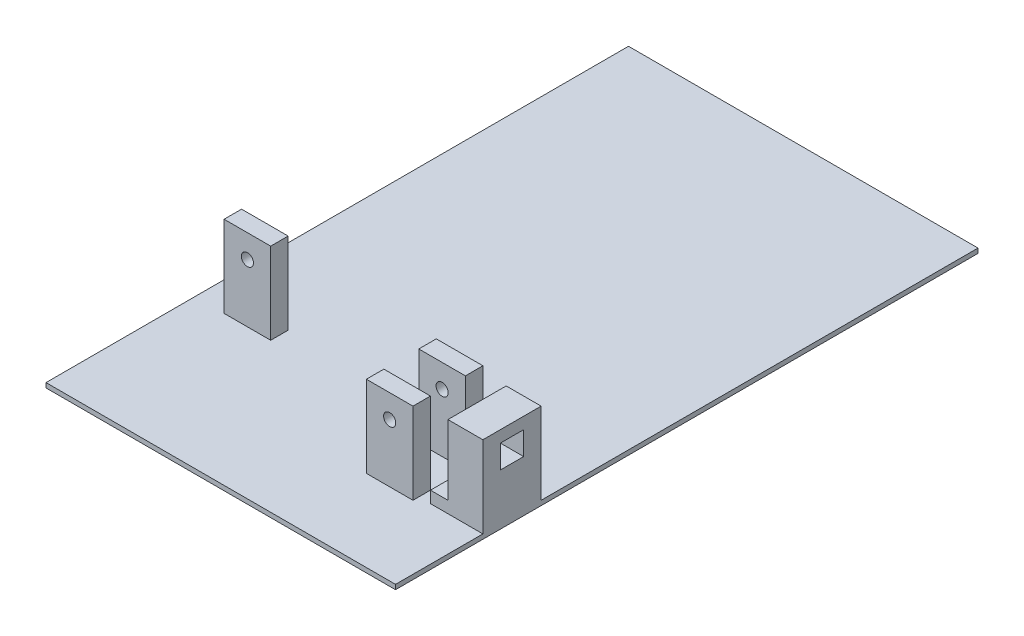
ISO-10303-21;
HEADER;
FILE_DESCRIPTION(('STEP AP214'),'2;1');
FILE_NAME('part.step','',(''),(''),'','','');
FILE_SCHEMA(('AUTOMOTIVE_DESIGN { 1 0 10303 214 1 1 1 1 }'));
ENDSEC;
DATA;
#1=APPLICATION_CONTEXT('core data for automotive mechanical design processes');
#2=APPLICATION_PROTOCOL_DEFINITION('international standard','automotive_design',2000,#1);
#3=PRODUCT_CONTEXT('',#1,'mechanical');
#4=PRODUCT('Part','Part','',(#3));
#5=PRODUCT_RELATED_PRODUCT_CATEGORY('part','',(#4));
#6=PRODUCT_DEFINITION_FORMATION('','',#4);
#7=PRODUCT_DEFINITION_CONTEXT('part definition',#1,'design');
#8=PRODUCT_DEFINITION('design','',#6,#7);
#9=PRODUCT_DEFINITION_SHAPE('','',#8);
#10=(LENGTH_UNIT() NAMED_UNIT(*) SI_UNIT(.MILLI.,.METRE.));
#11=(NAMED_UNIT(*) PLANE_ANGLE_UNIT() SI_UNIT($,.RADIAN.));
#12=(NAMED_UNIT(*) SI_UNIT($,.STERADIAN.) SOLID_ANGLE_UNIT());
#13=UNCERTAINTY_MEASURE_WITH_UNIT(LENGTH_MEASURE(1.E-05),#10,'distance_accuracy_value','');
#14=(GEOMETRIC_REPRESENTATION_CONTEXT(3) GLOBAL_UNCERTAINTY_ASSIGNED_CONTEXT((#13)) GLOBAL_UNIT_ASSIGNED_CONTEXT((#10,
#11,#12)) REPRESENTATION_CONTEXT('',''));
#15=CARTESIAN_POINT('',(0.,0.,0.));
#16=DIRECTION('',(0.,0.,1.));
#17=DIRECTION('',(1.,0.,0.));
#18=AXIS2_PLACEMENT_3D('',#15,#16,#17);
#19=CARTESIAN_POINT('',(300.,4.,0.));
#20=DIRECTION('',(-1.,0.,0.));
#21=DIRECTION('',(0.,0.,1.));
#22=AXIS2_PLACEMENT_3D('',#19,#20,#21);
#23=PLANE('',#22);
#24=DIRECTION('',(0.,0.,-1.));
#25=VECTOR('',#24,1.);
#26=CARTESIAN_POINT('',(300.,0.,0.));
#27=LINE('',#26,#25);
#28=CARTESIAN_POINT('',(300.,0.,0.));
#29=VERTEX_POINT('',#28);
#30=CARTESIAN_POINT('',(300.,0.,-500.));
#31=VERTEX_POINT('',#30);
#32=EDGE_CURVE('E386',#29,#31,#27,.T.);
#33=ORIENTED_EDGE('',*,*,#32,.T.);
#34=DIRECTION('',(0.,-1.,0.));
#35=VECTOR('',#34,1.);
#36=CARTESIAN_POINT('',(300.,4.,-500.));
#37=LINE('',#36,#35);
#38=CARTESIAN_POINT('',(300.,4.,-500.));
#39=VERTEX_POINT('',#38);
#40=EDGE_CURVE('E11',#39,#31,#37,.T.);
#41=ORIENTED_EDGE('',*,*,#40,.F.);
#42=DIRECTION('',(0.,0.,-1.));
#43=VECTOR('',#42,1.);
#44=CARTESIAN_POINT('',(300.,4.,0.));
#45=LINE('',#44,#43);
#46=CARTESIAN_POINT('',(300.,4.,-125.));
#47=VERTEX_POINT('',#46);
#48=EDGE_CURVE('E396',#47,#39,#45,.T.);
#49=ORIENTED_EDGE('',*,*,#48,.F.);
#50=DIRECTION('',(0.,-1.,0.));
#51=VECTOR('',#50,1.);
#52=CARTESIAN_POINT('',(300.,14.,-125.));
#53=LINE('',#52,#51);
#54=CARTESIAN_POINT('',(300.,74.,-125.));
#55=VERTEX_POINT('',#54);
#56=EDGE_CURVE('E384',#55,#47,#53,.T.);
#57=ORIENTED_EDGE('',*,*,#56,.F.);
#58=DIRECTION('',(0.,0.,1.));
#59=VECTOR('',#58,1.);
#60=CARTESIAN_POINT('',(300.,74.,0.));
#61=LINE('',#60,#59);
#62=CARTESIAN_POINT('',(300.,74.,-75.));
#63=VERTEX_POINT('',#62);
#64=EDGE_CURVE('E350',#55,#63,#61,.T.);
#65=ORIENTED_EDGE('',*,*,#64,.T.);
#66=DIRECTION('',(0.,-1.,0.));
#67=VECTOR('',#66,1.);
#68=CARTESIAN_POINT('',(300.,14.,-75.));
#69=LINE('',#68,#67);
#70=CARTESIAN_POINT('',(300.,4.,-75.));
#71=VERTEX_POINT('',#70);
#72=EDGE_CURVE('E376',#63,#71,#69,.T.);
#73=ORIENTED_EDGE('',*,*,#72,.T.);
#74=CARTESIAN_POINT('',(300.,4.,0.));
#75=VERTEX_POINT('',#74);
#76=EDGE_CURVE('E392',#75,#71,#45,.T.);
#77=ORIENTED_EDGE('',*,*,#76,.F.);
#78=DIRECTION('',(0.,-1.,0.));
#79=VECTOR('',#78,1.);
#80=CARTESIAN_POINT('',(300.,4.,0.));
#81=LINE('',#80,#79);
#82=EDGE_CURVE('E404',#75,#29,#81,.T.);
#83=ORIENTED_EDGE('',*,*,#82,.T.);
#84=EDGE_LOOP('',(#33,#41,#49,#57,#65,#73,#77,#83));
#85=FACE_BOUND('',#84,.T.);
#86=DIRECTION('',(0.,1.,0.));
#87=VECTOR('',#86,1.);
#88=CARTESIAN_POINT('',(300.,4.,-90.));
#89=LINE('',#88,#87);
#90=CARTESIAN_POINT('',(300.,44.,-90.));
#91=VERTEX_POINT('',#90);
#92=CARTESIAN_POINT('',(300.,64.,-90.));
#93=VERTEX_POINT('',#92);
#94=EDGE_CURVE('E55',#91,#93,#89,.T.);
#95=ORIENTED_EDGE('',*,*,#94,.T.);
#96=DIRECTION('',(0.,0.,-1.));
#97=VECTOR('',#96,1.);
#98=CARTESIAN_POINT('',(300.,64.,0.));
#99=LINE('',#98,#97);
#100=CARTESIAN_POINT('',(300.,64.,-110.));
#101=VERTEX_POINT('',#100);
#102=EDGE_CURVE('E232',#93,#101,#99,.T.);
#103=ORIENTED_EDGE('',*,*,#102,.T.);
#104=DIRECTION('',(0.,1.,0.));
#105=VECTOR('',#104,1.);
#106=CARTESIAN_POINT('',(300.,4.,-110.));
#107=LINE('',#106,#105);
#108=CARTESIAN_POINT('',(300.,44.,-110.));
#109=VERTEX_POINT('',#108);
#110=EDGE_CURVE('E480',#109,#101,#107,.T.);
#111=ORIENTED_EDGE('',*,*,#110,.F.);
#112=DIRECTION('',(0.,0.,-1.));
#113=VECTOR('',#112,1.);
#114=CARTESIAN_POINT('',(300.,44.,0.));
#115=LINE('',#114,#113);
#116=EDGE_CURVE('E228',#91,#109,#115,.T.);
#117=ORIENTED_EDGE('',*,*,#116,.F.);
#118=EDGE_LOOP('',(#95,#103,#111,#117));
#119=FACE_BOUND('',#118,.T.);
#120=ADVANCED_FACE('F39',(#85,#119),#23,.F.);
#121=CARTESIAN_POINT('',(0.,4.,0.));
#122=DIRECTION('',(0.,1.,0.));
#123=DIRECTION('',(0.,0.,1.));
#124=AXIS2_PLACEMENT_3D('',#121,#122,#123);
#125=PLANE('',#124);
#126=DIRECTION('',(1.,0.,0.));
#127=VECTOR('',#126,1.);
#128=CARTESIAN_POINT('',(0.,4.,-74.9999999999998));
#129=LINE('',#128,#127);
#130=CARTESIAN_POINT('',(255.,4.,-75.));
#131=VERTEX_POINT('',#130);
#132=EDGE_CURVE('E365',#131,#71,#129,.T.);
#133=ORIENTED_EDGE('',*,*,#132,.F.);
#134=DIRECTION('',(0.,0.,-1.));
#135=VECTOR('',#134,1.);
#136=CARTESIAN_POINT('',(255.,4.,-5.66213742558831E-13));
#137=LINE('',#136,#135);
#138=CARTESIAN_POINT('',(255.,4.,-125.));
#139=VERTEX_POINT('',#138);
#140=EDGE_CURVE('E379',#131,#139,#137,.T.);
#141=ORIENTED_EDGE('',*,*,#140,.T.);
#142=DIRECTION('',(1.,0.,0.));
#143=VECTOR('',#142,1.);
#144=CARTESIAN_POINT('',(0.,4.,-125.));
#145=LINE('',#144,#143);
#146=EDGE_CURVE('E370',#139,#47,#145,.T.);
#147=ORIENTED_EDGE('',*,*,#146,.T.);
#148=ORIENTED_EDGE('',*,*,#48,.T.);
#149=DIRECTION('',(1.,0.,0.));
#150=VECTOR('',#149,1.);
#151=CARTESIAN_POINT('',(0.,4.,-500.));
#152=LINE('',#151,#150);
#153=CARTESIAN_POINT('',(-1.11022302462516E-13,4.,-500.));
#154=VERTEX_POINT('',#153);
#155=EDGE_CURVE('E395',#154,#39,#152,.T.);
#156=ORIENTED_EDGE('',*,*,#155,.F.);
#157=DIRECTION('',(0.,0.,-1.));
#158=VECTOR('',#157,1.);
#159=CARTESIAN_POINT('',(0.,4.,0.));
#160=LINE('',#159,#158);
#161=CARTESIAN_POINT('',(0.,4.,0.));
#162=VERTEX_POINT('',#161);
#163=EDGE_CURVE('E399',#162,#154,#160,.T.);
#164=ORIENTED_EDGE('',*,*,#163,.F.);
#165=DIRECTION('',(1.,0.,0.));
#166=VECTOR('',#165,1.);
#167=CARTESIAN_POINT('',(0.,4.,0.));
#168=LINE('',#167,#166);
#169=EDGE_CURVE('E402',#162,#75,#168,.T.);
#170=ORIENTED_EDGE('',*,*,#169,.T.);
#171=ORIENTED_EDGE('',*,*,#76,.T.);
#172=EDGE_LOOP('',(#133,#141,#147,#148,#156,#164,#170,#171));
#173=FACE_BOUND('',#172,.T.);
#174=DIRECTION('',(1.,0.,0.));
#175=VECTOR('',#174,1.);
#176=CARTESIAN_POINT('',(0.,4.,-130.));
#177=LINE('',#176,#175);
#178=CARTESIAN_POINT('',(205.,4.,-130.));
#179=VERTEX_POINT('',#178);
#180=CARTESIAN_POINT('',(245.,4.,-130.));
#181=VERTEX_POINT('',#180);
#182=EDGE_CURVE('E330',#179,#181,#177,.T.);
#183=ORIENTED_EDGE('',*,*,#182,.T.);
#184=DIRECTION('',(0.,0.,-1.));
#185=VECTOR('',#184,1.);
#186=CARTESIAN_POINT('',(245.,4.,0.));
#187=LINE('',#186,#185);
#188=CARTESIAN_POINT('',(245.,4.,-115.));
#189=VERTEX_POINT('',#188);
#190=EDGE_CURVE('E314',#189,#181,#187,.T.);
#191=ORIENTED_EDGE('',*,*,#190,.F.);
#192=DIRECTION('',(-1.,0.,0.));
#193=VECTOR('',#192,1.);
#194=CARTESIAN_POINT('',(0.,4.,-115.));
#195=LINE('',#194,#193);
#196=CARTESIAN_POINT('',(205.,4.,-115.));
#197=VERTEX_POINT('',#196);
#198=EDGE_CURVE('E318',#189,#197,#195,.T.);
#199=ORIENTED_EDGE('',*,*,#198,.T.);
#200=DIRECTION('',(0.,0.,-1.));
#201=VECTOR('',#200,1.);
#202=CARTESIAN_POINT('',(205.,4.,0.));
#203=LINE('',#202,#201);
#204=EDGE_CURVE('E332',#197,#179,#203,.T.);
#205=ORIENTED_EDGE('',*,*,#204,.T.);
#206=EDGE_LOOP('',(#183,#191,#199,#205));
#207=FACE_BOUND('',#206,.T.);
#208=DIRECTION('',(0.,0.,-1.));
#209=VECTOR('',#208,1.);
#210=CARTESIAN_POINT('',(205.,4.,0.));
#211=LINE('',#210,#209);
#212=CARTESIAN_POINT('',(205.,4.,-70.));
#213=VERTEX_POINT('',#212);
#214=CARTESIAN_POINT('',(205.,4.,-85.));
#215=VERTEX_POINT('',#214);
#216=EDGE_CURVE('E299',#213,#215,#211,.T.);
#217=ORIENTED_EDGE('',*,*,#216,.T.);
#218=DIRECTION('',(-1.,0.,0.));
#219=VECTOR('',#218,1.);
#220=CARTESIAN_POINT('',(0.,4.,-84.9999999999999));
#221=LINE('',#220,#219);
#222=CARTESIAN_POINT('',(245.,4.,-85.));
#223=VERTEX_POINT('',#222);
#224=EDGE_CURVE('E285',#223,#215,#221,.T.);
#225=ORIENTED_EDGE('',*,*,#224,.F.);
#226=DIRECTION('',(0.,0.,-1.));
#227=VECTOR('',#226,1.);
#228=CARTESIAN_POINT('',(245.,4.,0.));
#229=LINE('',#228,#227);
#230=CARTESIAN_POINT('',(245.,4.,-70.));
#231=VERTEX_POINT('',#230);
#232=EDGE_CURVE('E289',#231,#223,#229,.T.);
#233=ORIENTED_EDGE('',*,*,#232,.F.);
#234=DIRECTION('',(1.,0.,0.));
#235=VECTOR('',#234,1.);
#236=CARTESIAN_POINT('',(0.,4.,-70.));
#237=LINE('',#236,#235);
#238=EDGE_CURVE('E302',#213,#231,#237,.T.);
#239=ORIENTED_EDGE('',*,*,#238,.F.);
#240=EDGE_LOOP('',(#217,#225,#233,#239));
#241=FACE_BOUND('',#240,.T.);
#242=DIRECTION('',(-1.,0.,0.));
#243=VECTOR('',#242,1.);
#244=CARTESIAN_POINT('',(0.,4.,-142.866666062451));
#245=LINE('',#244,#243);
#246=CARTESIAN_POINT('',(65.0000000000001,4.,-142.866666062451));
#247=VERTEX_POINT('',#246);
#248=CARTESIAN_POINT('',(25.0000000000001,4.,-142.866666062451));
#249=VERTEX_POINT('',#248);
#250=EDGE_CURVE('E63',#247,#249,#245,.T.);
#251=ORIENTED_EDGE('',*,*,#250,.F.);
#252=DIRECTION('',(0.,0.,-1.));
#253=VECTOR('',#252,1.);
#254=CARTESIAN_POINT('',(65.0000000000001,4.,0.));
#255=LINE('',#254,#253);
#256=CARTESIAN_POINT('',(65.0000000000001,4.,-127.866666062451));
#257=VERTEX_POINT('',#256);
#258=EDGE_CURVE('E255',#257,#247,#255,.T.);
#259=ORIENTED_EDGE('',*,*,#258,.F.);
#260=DIRECTION('',(-1.,0.,0.));
#261=VECTOR('',#260,1.);
#262=CARTESIAN_POINT('',(0.,4.,-127.866666062451));
#263=LINE('',#262,#261);
#264=CARTESIAN_POINT('',(25.0000000000001,4.,-127.866666062451));
#265=VERTEX_POINT('',#264);
#266=EDGE_CURVE('E260',#257,#265,#263,.T.);
#267=ORIENTED_EDGE('',*,*,#266,.T.);
#268=DIRECTION('',(0.,0.,-1.));
#269=VECTOR('',#268,1.);
#270=CARTESIAN_POINT('',(25.0000000000001,4.,0.));
#271=LINE('',#270,#269);
#272=EDGE_CURVE('E272',#265,#249,#271,.T.);
#273=ORIENTED_EDGE('',*,*,#272,.T.);
#274=EDGE_LOOP('',(#251,#259,#267,#273));
#275=FACE_BOUND('',#274,.T.);
#276=ADVANCED_FACE('F447',(#173,#207,#241,#275),#125,.T.);
#277=CARTESIAN_POINT('',(0.,14.,0.));
#278=DIRECTION('',(0.,1.,0.));
#279=DIRECTION('',(0.,0.,1.));
#280=AXIS2_PLACEMENT_3D('',#277,#278,#279);
#281=PLANE('',#280);
#282=DIRECTION('',(1.,0.,0.));
#283=VECTOR('',#282,1.);
#284=CARTESIAN_POINT('',(0.,14.,-74.9999999999998));
#285=LINE('',#284,#283);
#286=CARTESIAN_POINT('',(255.,14.,-75.));
#287=VERTEX_POINT('',#286);
#288=CARTESIAN_POINT('',(270.,14.,-75.));
#289=VERTEX_POINT('',#288);
#290=EDGE_CURVE('E366',#287,#289,#285,.T.);
#291=ORIENTED_EDGE('',*,*,#290,.T.);
#292=DIRECTION('',(0.,0.,-1.));
#293=VECTOR('',#292,1.);
#294=CARTESIAN_POINT('',(270.,14.,0.));
#295=LINE('',#294,#293);
#296=CARTESIAN_POINT('',(270.,14.,-125.));
#297=VERTEX_POINT('',#296);
#298=EDGE_CURVE('E346',#289,#297,#295,.T.);
#299=ORIENTED_EDGE('',*,*,#298,.T.);
#300=DIRECTION('',(1.,0.,0.));
#301=VECTOR('',#300,1.);
#302=CARTESIAN_POINT('',(0.,14.,-125.));
#303=LINE('',#302,#301);
#304=CARTESIAN_POINT('',(255.,14.,-125.));
#305=VERTEX_POINT('',#304);
#306=EDGE_CURVE('E373',#305,#297,#303,.T.);
#307=ORIENTED_EDGE('',*,*,#306,.F.);
#308=DIRECTION('',(0.,0.,-1.));
#309=VECTOR('',#308,1.);
#310=CARTESIAN_POINT('',(255.,14.,-5.66213742558831E-13));
#311=LINE('',#310,#309);
#312=EDGE_CURVE('E369',#287,#305,#311,.T.);
#313=ORIENTED_EDGE('',*,*,#312,.F.);
#314=EDGE_LOOP('',(#291,#299,#307,#313));
#315=FACE_BOUND('',#314,.T.);
#316=ADVANCED_FACE('F470',(#315),#281,.T.);
#317=CARTESIAN_POINT('',(0.,4.,-500.));
#318=DIRECTION('',(0.,0.,-1.));
#319=DIRECTION('',(-1.,0.,0.));
#320=AXIS2_PLACEMENT_3D('',#317,#318,#319);
#321=PLANE('',#320);
#322=DIRECTION('',(1.,0.,0.));
#323=VECTOR('',#322,1.);
#324=CARTESIAN_POINT('',(0.,0.,-500.));
#325=LINE('',#324,#323);
#326=CARTESIAN_POINT('',(-1.11022302462516E-13,0.,-500.));
#327=VERTEX_POINT('',#326);
#328=EDGE_CURVE('E407',#327,#31,#325,.T.);
#329=ORIENTED_EDGE('',*,*,#328,.F.);
#330=DIRECTION('',(0.,-1.,0.));
#331=VECTOR('',#330,1.);
#332=CARTESIAN_POINT('',(-1.11022302462516E-13,4.,-500.));
#333=LINE('',#332,#331);
#334=EDGE_CURVE('E47',#154,#327,#333,.T.);
#335=ORIENTED_EDGE('',*,*,#334,.F.);
#336=ORIENTED_EDGE('',*,*,#155,.T.);
#337=ORIENTED_EDGE('',*,*,#40,.T.);
#338=EDGE_LOOP('',(#329,#335,#336,#337));
#339=FACE_BOUND('',#338,.T.);
#340=ADVANCED_FACE('F543',(#339),#321,.T.);
#341=CARTESIAN_POINT('',(0.,4.,0.));
#342=DIRECTION('',(-1.,0.,0.));
#343=DIRECTION('',(0.,0.,1.));
#344=AXIS2_PLACEMENT_3D('',#341,#342,#343);
#345=PLANE('',#344);
#346=DIRECTION('',(0.,0.,-1.));
#347=VECTOR('',#346,1.);
#348=CARTESIAN_POINT('',(0.,0.,0.));
#349=LINE('',#348,#347);
#350=CARTESIAN_POINT('',(0.,0.,0.));
#351=VERTEX_POINT('',#350);
#352=EDGE_CURVE('E410',#351,#327,#349,.T.);
#353=ORIENTED_EDGE('',*,*,#352,.F.);
#354=DIRECTION('',(0.,-1.,0.));
#355=VECTOR('',#354,1.);
#356=CARTESIAN_POINT('',(0.,4.,0.));
#357=LINE('',#356,#355);
#358=EDGE_CURVE('E417',#162,#351,#357,.T.);
#359=ORIENTED_EDGE('',*,*,#358,.F.);
#360=ORIENTED_EDGE('',*,*,#163,.T.);
#361=ORIENTED_EDGE('',*,*,#334,.T.);
#362=EDGE_LOOP('',(#353,#359,#360,#361));
#363=FACE_BOUND('',#362,.T.);
#364=ADVANCED_FACE('F536',(#363),#345,.T.);
#365=CARTESIAN_POINT('',(0.,4.,0.));
#366=DIRECTION('',(0.,0.,-1.));
#367=DIRECTION('',(-1.,0.,0.));
#368=AXIS2_PLACEMENT_3D('',#365,#366,#367);
#369=PLANE('',#368);
#370=DIRECTION('',(1.,0.,0.));
#371=VECTOR('',#370,1.);
#372=CARTESIAN_POINT('',(0.,0.,0.));
#373=LINE('',#372,#371);
#374=EDGE_CURVE('E413',#351,#29,#373,.T.);
#375=ORIENTED_EDGE('',*,*,#374,.T.);
#376=ORIENTED_EDGE('',*,*,#82,.F.);
#377=ORIENTED_EDGE('',*,*,#169,.F.);
#378=ORIENTED_EDGE('',*,*,#358,.T.);
#379=EDGE_LOOP('',(#375,#376,#377,#378));
#380=FACE_BOUND('',#379,.T.);
#381=ADVANCED_FACE('F540',(#380),#369,.F.);
#382=CARTESIAN_POINT('',(0.,0.,0.));
#383=DIRECTION('',(0.,1.,0.));
#384=DIRECTION('',(0.,0.,1.));
#385=AXIS2_PLACEMENT_3D('',#382,#383,#384);
#386=PLANE('',#385);
#387=ORIENTED_EDGE('',*,*,#32,.F.);
#388=ORIENTED_EDGE('',*,*,#374,.F.);
#389=ORIENTED_EDGE('',*,*,#352,.T.);
#390=ORIENTED_EDGE('',*,*,#328,.T.);
#391=EDGE_LOOP('',(#387,#388,#389,#390));
#392=FACE_BOUND('',#391,.T.);
#393=ADVANCED_FACE('F542',(#392),#386,.F.);
#394=CARTESIAN_POINT('',(0.,14.,-125.));
#395=DIRECTION('',(0.,0.,-1.));
#396=DIRECTION('',(-1.,0.,0.));
#397=AXIS2_PLACEMENT_3D('',#394,#395,#396);
#398=PLANE('',#397);
#399=ORIENTED_EDGE('',*,*,#146,.F.);
#400=DIRECTION('',(0.,-1.,0.));
#401=VECTOR('',#400,1.);
#402=CARTESIAN_POINT('',(255.,14.,-125.));
#403=LINE('',#402,#401);
#404=EDGE_CURVE('E387',#305,#139,#403,.T.);
#405=ORIENTED_EDGE('',*,*,#404,.F.);
#406=ORIENTED_EDGE('',*,*,#306,.T.);
#407=DIRECTION('',(0.,-1.,0.));
#408=VECTOR('',#407,1.);
#409=CARTESIAN_POINT('',(270.,74.,-125.));
#410=LINE('',#409,#408);
#411=CARTESIAN_POINT('',(270.,74.,-125.));
#412=VERTEX_POINT('',#411);
#413=EDGE_CURVE('E363',#412,#297,#410,.T.);
#414=ORIENTED_EDGE('',*,*,#413,.F.);
#415=DIRECTION('',(1.,0.,0.));
#416=VECTOR('',#415,1.);
#417=CARTESIAN_POINT('',(0.,74.,-125.));
#418=LINE('',#417,#416);
#419=EDGE_CURVE('E353',#412,#55,#418,.T.);
#420=ORIENTED_EDGE('',*,*,#419,.T.);
#421=ORIENTED_EDGE('',*,*,#56,.T.);
#422=EDGE_LOOP('',(#399,#405,#406,#414,#420,#421));
#423=FACE_BOUND('',#422,.T.);
#424=ADVANCED_FACE('F522',(#423),#398,.T.);
#425=CARTESIAN_POINT('',(255.,14.,-5.66213742558831E-13));
#426=DIRECTION('',(-1.,0.,0.));
#427=DIRECTION('',(0.,0.,1.));
#428=AXIS2_PLACEMENT_3D('',#425,#426,#427);
#429=PLANE('',#428);
#430=ORIENTED_EDGE('',*,*,#140,.F.);
#431=DIRECTION('',(0.,-1.,0.));
#432=VECTOR('',#431,1.);
#433=CARTESIAN_POINT('',(255.,14.,-75.));
#434=LINE('',#433,#432);
#435=EDGE_CURVE('E389',#287,#131,#434,.T.);
#436=ORIENTED_EDGE('',*,*,#435,.F.);
#437=ORIENTED_EDGE('',*,*,#312,.T.);
#438=ORIENTED_EDGE('',*,*,#404,.T.);
#439=EDGE_LOOP('',(#430,#436,#437,#438));
#440=FACE_BOUND('',#439,.T.);
#441=ADVANCED_FACE('F524',(#440),#429,.T.);
#442=CARTESIAN_POINT('',(0.,14.,-74.9999999999998));
#443=DIRECTION('',(0.,0.,-1.));
#444=DIRECTION('',(-1.,0.,0.));
#445=AXIS2_PLACEMENT_3D('',#442,#443,#444);
#446=PLANE('',#445);
#447=ORIENTED_EDGE('',*,*,#132,.T.);
#448=ORIENTED_EDGE('',*,*,#72,.F.);
#449=DIRECTION('',(1.,0.,0.));
#450=VECTOR('',#449,1.);
#451=CARTESIAN_POINT('',(0.,74.,-74.9999999999998));
#452=LINE('',#451,#450);
#453=CARTESIAN_POINT('',(270.,74.,-75.));
#454=VERTEX_POINT('',#453);
#455=EDGE_CURVE('E347',#454,#63,#452,.T.);
#456=ORIENTED_EDGE('',*,*,#455,.F.);
#457=DIRECTION('',(0.,-1.,0.));
#458=VECTOR('',#457,1.);
#459=CARTESIAN_POINT('',(270.,74.,-75.));
#460=LINE('',#459,#458);
#461=EDGE_CURVE('E359',#454,#289,#460,.T.);
#462=ORIENTED_EDGE('',*,*,#461,.T.);
#463=ORIENTED_EDGE('',*,*,#290,.F.);
#464=ORIENTED_EDGE('',*,*,#435,.T.);
#465=EDGE_LOOP('',(#447,#448,#456,#462,#463,#464));
#466=FACE_BOUND('',#465,.T.);
#467=ADVANCED_FACE('F506',(#466),#446,.F.);
#468=CARTESIAN_POINT('',(270.,74.,0.));
#469=DIRECTION('',(-1.,0.,0.));
#470=DIRECTION('',(0.,0.,1.));
#471=AXIS2_PLACEMENT_3D('',#468,#469,#470);
#472=PLANE('',#471);
#473=CARTESIAN_POINT('',(270.,54.,-100.));
#474=DIRECTION('',(-1.,0.,0.));
#475=DIRECTION('',(0.,0.,1.));
#476=AXIS2_PLACEMENT_3D('',#473,#474,#475);
#477=CIRCLE('',#476,3.25000000000001);
#478=CARTESIAN_POINT('',(270.,54.,-96.75));
#479=VERTEX_POINT('',#478);
#480=EDGE_CURVE('E483',#479,#479,#477,.T.);
#481=ORIENTED_EDGE('',*,*,#480,.F.);
#482=EDGE_LOOP('',(#481));
#483=FACE_BOUND('',#482,.T.);
#484=ORIENTED_EDGE('',*,*,#298,.F.);
#485=ORIENTED_EDGE('',*,*,#461,.F.);
#486=DIRECTION('',(0.,0.,-1.));
#487=VECTOR('',#486,1.);
#488=CARTESIAN_POINT('',(270.,74.,0.));
#489=LINE('',#488,#487);
#490=EDGE_CURVE('E356',#454,#412,#489,.T.);
#491=ORIENTED_EDGE('',*,*,#490,.T.);
#492=ORIENTED_EDGE('',*,*,#413,.T.);
#493=EDGE_LOOP('',(#484,#485,#491,#492));
#494=FACE_BOUND('',#493,.T.);
#495=ADVANCED_FACE('F502',(#483,#494),#472,.T.);
#496=CARTESIAN_POINT('',(0.,74.,0.));
#497=DIRECTION('',(0.,-1.,0.));
#498=DIRECTION('',(0.,0.,-1.));
#499=AXIS2_PLACEMENT_3D('',#496,#497,#498);
#500=PLANE('',#499);
#501=ORIENTED_EDGE('',*,*,#455,.T.);
#502=ORIENTED_EDGE('',*,*,#64,.F.);
#503=ORIENTED_EDGE('',*,*,#419,.F.);
#504=ORIENTED_EDGE('',*,*,#490,.F.);
#505=EDGE_LOOP('',(#501,#502,#503,#504));
#506=FACE_BOUND('',#505,.T.);
#507=ADVANCED_FACE('F505',(#506),#500,.F.);
#508=CARTESIAN_POINT('',(245.,74.,0.));
#509=DIRECTION('',(-1.,0.,0.));
#510=DIRECTION('',(0.,0.,1.));
#511=AXIS2_PLACEMENT_3D('',#508,#509,#510);
#512=PLANE('',#511);
#513=ORIENTED_EDGE('',*,*,#190,.T.);
#514=DIRECTION('',(0.,-1.,0.));
#515=VECTOR('',#514,1.);
#516=CARTESIAN_POINT('',(245.,74.,-130.));
#517=LINE('',#516,#515);
#518=CARTESIAN_POINT('',(245.,74.,-130.));
#519=VERTEX_POINT('',#518);
#520=EDGE_CURVE('E343',#519,#181,#517,.T.);
#521=ORIENTED_EDGE('',*,*,#520,.F.);
#522=DIRECTION('',(0.,0.,-1.));
#523=VECTOR('',#522,1.);
#524=CARTESIAN_POINT('',(245.,74.,0.));
#525=LINE('',#524,#523);
#526=CARTESIAN_POINT('',(245.,74.,-115.));
#527=VERTEX_POINT('',#526);
#528=EDGE_CURVE('E315',#527,#519,#525,.T.);
#529=ORIENTED_EDGE('',*,*,#528,.F.);
#530=DIRECTION('',(0.,-1.,0.));
#531=VECTOR('',#530,1.);
#532=CARTESIAN_POINT('',(245.,74.,-115.));
#533=LINE('',#532,#531);
#534=EDGE_CURVE('E327',#527,#189,#533,.T.);
#535=ORIENTED_EDGE('',*,*,#534,.T.);
#536=EDGE_LOOP('',(#513,#521,#529,#535));
#537=FACE_BOUND('',#536,.T.);
#538=ADVANCED_FACE('F564',(#537),#512,.F.);
#539=CARTESIAN_POINT('',(0.,74.,-130.));
#540=DIRECTION('',(0.,0.,-1.));
#541=DIRECTION('',(-1.,0.,0.));
#542=AXIS2_PLACEMENT_3D('',#539,#540,#541);
#543=PLANE('',#542);
#544=CARTESIAN_POINT('',(225.,54.,-130.));
#545=DIRECTION('',(0.,0.,-1.));
#546=DIRECTION('',(-1.,0.,0.));
#547=AXIS2_PLACEMENT_3D('',#544,#545,#546);
#548=CIRCLE('',#547,5.19999999999998);
#549=CARTESIAN_POINT('',(219.8,54.,-130.));
#550=VERTEX_POINT('',#549);
#551=EDGE_CURVE('E252',#550,#550,#548,.T.);
#552=ORIENTED_EDGE('',*,*,#551,.F.);
#553=EDGE_LOOP('',(#552));
#554=FACE_BOUND('',#553,.T.);
#555=ORIENTED_EDGE('',*,*,#182,.F.);
#556=DIRECTION('',(0.,-1.,0.));
#557=VECTOR('',#556,1.);
#558=CARTESIAN_POINT('',(205.,74.,-130.));
#559=LINE('',#558,#557);
#560=CARTESIAN_POINT('',(205.,74.,-130.));
#561=VERTEX_POINT('',#560);
#562=EDGE_CURVE('E340',#561,#179,#559,.T.);
#563=ORIENTED_EDGE('',*,*,#562,.F.);
#564=DIRECTION('',(1.,0.,0.));
#565=VECTOR('',#564,1.);
#566=CARTESIAN_POINT('',(0.,74.,-130.));
#567=LINE('',#566,#565);
#568=EDGE_CURVE('E317',#561,#519,#567,.T.);
#569=ORIENTED_EDGE('',*,*,#568,.T.);
#570=ORIENTED_EDGE('',*,*,#520,.T.);
#571=EDGE_LOOP('',(#555,#563,#569,#570));
#572=FACE_BOUND('',#571,.T.);
#573=ADVANCED_FACE('F567',(#554,#572),#543,.T.);
#574=CARTESIAN_POINT('',(205.,74.,0.));
#575=DIRECTION('',(-1.,0.,0.));
#576=DIRECTION('',(0.,0.,1.));
#577=AXIS2_PLACEMENT_3D('',#574,#575,#576);
#578=PLANE('',#577);
#579=ORIENTED_EDGE('',*,*,#204,.F.);
#580=DIRECTION('',(0.,-1.,0.));
#581=VECTOR('',#580,1.);
#582=CARTESIAN_POINT('',(205.,74.,-115.));
#583=LINE('',#582,#581);
#584=CARTESIAN_POINT('',(205.,74.,-115.));
#585=VERTEX_POINT('',#584);
#586=EDGE_CURVE('E337',#585,#197,#583,.T.);
#587=ORIENTED_EDGE('',*,*,#586,.F.);
#588=DIRECTION('',(0.,0.,-1.));
#589=VECTOR('',#588,1.);
#590=CARTESIAN_POINT('',(205.,74.,0.));
#591=LINE('',#590,#589);
#592=EDGE_CURVE('E321',#585,#561,#591,.T.);
#593=ORIENTED_EDGE('',*,*,#592,.T.);
#594=ORIENTED_EDGE('',*,*,#562,.T.);
#595=EDGE_LOOP('',(#579,#587,#593,#594));
#596=FACE_BOUND('',#595,.T.);
#597=ADVANCED_FACE('F571',(#596),#578,.T.);
#598=CARTESIAN_POINT('',(0.,74.,-115.));
#599=DIRECTION('',(0.,0.,1.));
#600=DIRECTION('',(1.,0.,0.));
#601=AXIS2_PLACEMENT_3D('',#598,#599,#600);
#602=PLANE('',#601);
#603=CARTESIAN_POINT('',(225.,54.,-115.));
#604=DIRECTION('',(0.,0.,1.));
#605=DIRECTION('',(1.,0.,0.));
#606=AXIS2_PLACEMENT_3D('',#603,#604,#605);
#607=CIRCLE('',#606,5.19999999999998);
#608=CARTESIAN_POINT('',(230.2,54.,-115.));
#609=VERTEX_POINT('',#608);
#610=EDGE_CURVE('E249',#609,#609,#607,.T.);
#611=ORIENTED_EDGE('',*,*,#610,.F.);
#612=EDGE_LOOP('',(#611));
#613=FACE_BOUND('',#612,.T.);
#614=ORIENTED_EDGE('',*,*,#198,.F.);
#615=ORIENTED_EDGE('',*,*,#534,.F.);
#616=DIRECTION('',(-1.,0.,0.));
#617=VECTOR('',#616,1.);
#618=CARTESIAN_POINT('',(0.,74.,-115.));
#619=LINE('',#618,#617);
#620=EDGE_CURVE('E324',#527,#585,#619,.T.);
#621=ORIENTED_EDGE('',*,*,#620,.T.);
#622=ORIENTED_EDGE('',*,*,#586,.T.);
#623=EDGE_LOOP('',(#614,#615,#621,#622));
#624=FACE_BOUND('',#623,.T.);
#625=ADVANCED_FACE('F575',(#613,#624),#602,.T.);
#626=CARTESIAN_POINT('',(0.,74.,0.));
#627=DIRECTION('',(0.,-1.,0.));
#628=DIRECTION('',(0.,0.,-1.));
#629=AXIS2_PLACEMENT_3D('',#626,#627,#628);
#630=PLANE('',#629);
#631=ORIENTED_EDGE('',*,*,#528,.T.);
#632=ORIENTED_EDGE('',*,*,#568,.F.);
#633=ORIENTED_EDGE('',*,*,#592,.F.);
#634=ORIENTED_EDGE('',*,*,#620,.F.);
#635=EDGE_LOOP('',(#631,#632,#633,#634));
#636=FACE_BOUND('',#635,.T.);
#637=ADVANCED_FACE('F437',(#636),#630,.F.);
#638=CARTESIAN_POINT('',(0.,74.,-84.9999999999999));
#639=DIRECTION('',(0.,0.,1.));
#640=DIRECTION('',(1.,0.,0.));
#641=AXIS2_PLACEMENT_3D('',#638,#639,#640);
#642=PLANE('',#641);
#643=CARTESIAN_POINT('',(225.,54.,-85.));
#644=DIRECTION('',(0.,0.,1.));
#645=DIRECTION('',(1.,0.,0.));
#646=AXIS2_PLACEMENT_3D('',#643,#644,#645);
#647=CIRCLE('',#646,5.19999999999998);
#648=CARTESIAN_POINT('',(230.2,54.,-85.));
#649=VERTEX_POINT('',#648);
#650=EDGE_CURVE('E246',#649,#649,#647,.T.);
#651=ORIENTED_EDGE('',*,*,#650,.T.);
#652=EDGE_LOOP('',(#651));
#653=FACE_BOUND('',#652,.T.);
#654=ORIENTED_EDGE('',*,*,#224,.T.);
#655=DIRECTION('',(0.,-1.,0.));
#656=VECTOR('',#655,1.);
#657=CARTESIAN_POINT('',(205.,74.,-85.));
#658=LINE('',#657,#656);
#659=CARTESIAN_POINT('',(205.,74.,-85.));
#660=VERTEX_POINT('',#659);
#661=EDGE_CURVE('E312',#660,#215,#658,.T.);
#662=ORIENTED_EDGE('',*,*,#661,.F.);
#663=DIRECTION('',(-1.,0.,0.));
#664=VECTOR('',#663,1.);
#665=CARTESIAN_POINT('',(0.,74.,-84.9999999999999));
#666=LINE('',#665,#664);
#667=CARTESIAN_POINT('',(245.,74.,-85.));
#668=VERTEX_POINT('',#667);
#669=EDGE_CURVE('E286',#668,#660,#666,.T.);
#670=ORIENTED_EDGE('',*,*,#669,.F.);
#671=DIRECTION('',(0.,-1.,0.));
#672=VECTOR('',#671,1.);
#673=CARTESIAN_POINT('',(245.,74.,-85.));
#674=LINE('',#673,#672);
#675=EDGE_CURVE('E296',#668,#223,#674,.T.);
#676=ORIENTED_EDGE('',*,*,#675,.T.);
#677=EDGE_LOOP('',(#654,#662,#670,#676));
#678=FACE_BOUND('',#677,.T.);
#679=ADVANCED_FACE('F433',(#653,#678),#642,.F.);
#680=CARTESIAN_POINT('',(205.,74.,0.));
#681=DIRECTION('',(-1.,0.,0.));
#682=DIRECTION('',(0.,0.,1.));
#683=AXIS2_PLACEMENT_3D('',#680,#681,#682);
#684=PLANE('',#683);
#685=ORIENTED_EDGE('',*,*,#216,.F.);
#686=DIRECTION('',(0.,-1.,0.));
#687=VECTOR('',#686,1.);
#688=CARTESIAN_POINT('',(205.,74.,-70.));
#689=LINE('',#688,#687);
#690=CARTESIAN_POINT('',(205.,74.,-70.));
#691=VERTEX_POINT('',#690);
#692=EDGE_CURVE('E310',#691,#213,#689,.T.);
#693=ORIENTED_EDGE('',*,*,#692,.F.);
#694=DIRECTION('',(0.,0.,-1.));
#695=VECTOR('',#694,1.);
#696=CARTESIAN_POINT('',(205.,74.,0.));
#697=LINE('',#696,#695);
#698=EDGE_CURVE('E288',#691,#660,#697,.T.);
#699=ORIENTED_EDGE('',*,*,#698,.T.);
#700=ORIENTED_EDGE('',*,*,#661,.T.);
#701=EDGE_LOOP('',(#685,#693,#699,#700));
#702=FACE_BOUND('',#701,.T.);
#703=ADVANCED_FACE('F436',(#702),#684,.T.);
#704=CARTESIAN_POINT('',(0.,74.,-70.));
#705=DIRECTION('',(0.,0.,-1.));
#706=DIRECTION('',(-1.,0.,0.));
#707=AXIS2_PLACEMENT_3D('',#704,#705,#706);
#708=PLANE('',#707);
#709=CARTESIAN_POINT('',(225.,54.,-70.));
#710=DIRECTION('',(0.,0.,-1.));
#711=DIRECTION('',(-1.,0.,0.));
#712=AXIS2_PLACEMENT_3D('',#709,#710,#711);
#713=CIRCLE('',#712,5.19999999999998);
#714=CARTESIAN_POINT('',(219.8,54.,-70.));
#715=VERTEX_POINT('',#714);
#716=EDGE_CURVE('E245',#715,#715,#713,.T.);
#717=ORIENTED_EDGE('',*,*,#716,.T.);
#718=EDGE_LOOP('',(#717));
#719=FACE_BOUND('',#718,.T.);
#720=ORIENTED_EDGE('',*,*,#238,.T.);
#721=DIRECTION('',(0.,-1.,0.));
#722=VECTOR('',#721,1.);
#723=CARTESIAN_POINT('',(245.,74.,-70.));
#724=LINE('',#723,#722);
#725=CARTESIAN_POINT('',(245.,74.,-70.));
#726=VERTEX_POINT('',#725);
#727=EDGE_CURVE('E308',#726,#231,#724,.T.);
#728=ORIENTED_EDGE('',*,*,#727,.F.);
#729=DIRECTION('',(1.,0.,0.));
#730=VECTOR('',#729,1.);
#731=CARTESIAN_POINT('',(0.,74.,-70.));
#732=LINE('',#731,#730);
#733=EDGE_CURVE('E292',#691,#726,#732,.T.);
#734=ORIENTED_EDGE('',*,*,#733,.F.);
#735=ORIENTED_EDGE('',*,*,#692,.T.);
#736=EDGE_LOOP('',(#720,#728,#734,#735));
#737=FACE_BOUND('',#736,.T.);
#738=ADVANCED_FACE('F422',(#719,#737),#708,.F.);
#739=CARTESIAN_POINT('',(245.,74.,0.));
#740=DIRECTION('',(-1.,0.,0.));
#741=DIRECTION('',(0.,0.,1.));
#742=AXIS2_PLACEMENT_3D('',#739,#740,#741);
#743=PLANE('',#742);
#744=ORIENTED_EDGE('',*,*,#232,.T.);
#745=ORIENTED_EDGE('',*,*,#675,.F.);
#746=DIRECTION('',(0.,0.,-1.));
#747=VECTOR('',#746,1.);
#748=CARTESIAN_POINT('',(245.,74.,0.));
#749=LINE('',#748,#747);
#750=EDGE_CURVE('E294',#726,#668,#749,.T.);
#751=ORIENTED_EDGE('',*,*,#750,.F.);
#752=ORIENTED_EDGE('',*,*,#727,.T.);
#753=EDGE_LOOP('',(#744,#745,#751,#752));
#754=FACE_BOUND('',#753,.T.);
#755=ADVANCED_FACE('F456',(#754),#743,.F.);
#756=CARTESIAN_POINT('',(0.,74.,0.));
#757=DIRECTION('',(0.,-1.,0.));
#758=DIRECTION('',(0.,0.,-1.));
#759=AXIS2_PLACEMENT_3D('',#756,#757,#758);
#760=PLANE('',#759);
#761=ORIENTED_EDGE('',*,*,#669,.T.);
#762=ORIENTED_EDGE('',*,*,#698,.F.);
#763=ORIENTED_EDGE('',*,*,#733,.T.);
#764=ORIENTED_EDGE('',*,*,#750,.T.);
#765=EDGE_LOOP('',(#761,#762,#763,#764));
#766=FACE_BOUND('',#765,.T.);
#767=ADVANCED_FACE('F452',(#766),#760,.F.);
#768=CARTESIAN_POINT('',(65.0000000000001,74.,0.));
#769=DIRECTION('',(-1.,0.,0.));
#770=DIRECTION('',(0.,0.,1.));
#771=AXIS2_PLACEMENT_3D('',#768,#769,#770);
#772=PLANE('',#771);
#773=ORIENTED_EDGE('',*,*,#258,.T.);
#774=DIRECTION('',(0.,-1.,0.));
#775=VECTOR('',#774,1.);
#776=CARTESIAN_POINT('',(65.0000000000001,74.,-142.866666062451));
#777=LINE('',#776,#775);
#778=CARTESIAN_POINT('',(65.0000000000001,74.,-142.866666062451));
#779=VERTEX_POINT('',#778);
#780=EDGE_CURVE('E283',#779,#247,#777,.T.);
#781=ORIENTED_EDGE('',*,*,#780,.F.);
#782=DIRECTION('',(0.,0.,-1.));
#783=VECTOR('',#782,1.);
#784=CARTESIAN_POINT('',(65.0000000000001,74.,0.));
#785=LINE('',#784,#783);
#786=CARTESIAN_POINT('',(65.0000000000001,74.,-127.866666062451));
#787=VERTEX_POINT('',#786);
#788=EDGE_CURVE('E256',#787,#779,#785,.T.);
#789=ORIENTED_EDGE('',*,*,#788,.F.);
#790=DIRECTION('',(0.,-1.,0.));
#791=VECTOR('',#790,1.);
#792=CARTESIAN_POINT('',(65.0000000000001,74.,-127.866666062451));
#793=LINE('',#792,#791);
#794=EDGE_CURVE('E268',#787,#257,#793,.T.);
#795=ORIENTED_EDGE('',*,*,#794,.T.);
#796=EDGE_LOOP('',(#773,#781,#789,#795));
#797=FACE_BOUND('',#796,.T.);
#798=ADVANCED_FACE('F623',(#797),#772,.F.);
#799=CARTESIAN_POINT('',(0.,74.,-142.866666062451));
#800=DIRECTION('',(0.,0.,1.));
#801=DIRECTION('',(1.,0.,0.));
#802=AXIS2_PLACEMENT_3D('',#799,#800,#801);
#803=PLANE('',#802);
#804=CARTESIAN_POINT('',(45.0000000000001,54.,-142.866666062451));
#805=DIRECTION('',(0.,0.,1.));
#806=DIRECTION('',(1.,0.,0.));
#807=AXIS2_PLACEMENT_3D('',#804,#805,#806);
#808=CIRCLE('',#807,5.19999999999999);
#809=CARTESIAN_POINT('',(50.2000000000001,54.,-142.866666062451));
#810=VERTEX_POINT('',#809);
#811=EDGE_CURVE('E237',#810,#810,#808,.T.);
#812=ORIENTED_EDGE('',*,*,#811,.T.);
#813=EDGE_LOOP('',(#812));
#814=FACE_BOUND('',#813,.T.);
#815=ORIENTED_EDGE('',*,*,#250,.T.);
#816=DIRECTION('',(0.,-1.,0.));
#817=VECTOR('',#816,1.);
#818=CARTESIAN_POINT('',(25.0000000000001,74.,-142.866666062451));
#819=LINE('',#818,#817);
#820=CARTESIAN_POINT('',(25.0000000000001,74.,-142.866666062451));
#821=VERTEX_POINT('',#820);
#822=EDGE_CURVE('E280',#821,#249,#819,.T.);
#823=ORIENTED_EDGE('',*,*,#822,.F.);
#824=DIRECTION('',(-1.,0.,0.));
#825=VECTOR('',#824,1.);
#826=CARTESIAN_POINT('',(0.,74.,-142.866666062451));
#827=LINE('',#826,#825);
#828=EDGE_CURVE('E259',#779,#821,#827,.T.);
#829=ORIENTED_EDGE('',*,*,#828,.F.);
#830=ORIENTED_EDGE('',*,*,#780,.T.);
#831=EDGE_LOOP('',(#815,#823,#829,#830));
#832=FACE_BOUND('',#831,.T.);
#833=ADVANCED_FACE('F633',(#814,#832),#803,.F.);
#834=CARTESIAN_POINT('',(25.0000000000001,74.,0.));
#835=DIRECTION('',(-1.,0.,0.));
#836=DIRECTION('',(0.,0.,1.));
#837=AXIS2_PLACEMENT_3D('',#834,#835,#836);
#838=PLANE('',#837);
#839=ORIENTED_EDGE('',*,*,#272,.F.);
#840=DIRECTION('',(0.,-1.,0.));
#841=VECTOR('',#840,1.);
#842=CARTESIAN_POINT('',(25.0000000000001,74.,-127.866666062451));
#843=LINE('',#842,#841);
#844=CARTESIAN_POINT('',(25.0000000000001,74.,-127.866666062451));
#845=VERTEX_POINT('',#844);
#846=EDGE_CURVE('E277',#845,#265,#843,.T.);
#847=ORIENTED_EDGE('',*,*,#846,.F.);
#848=DIRECTION('',(0.,0.,-1.));
#849=VECTOR('',#848,1.);
#850=CARTESIAN_POINT('',(25.0000000000001,74.,0.));
#851=LINE('',#850,#849);
#852=EDGE_CURVE('E262',#845,#821,#851,.T.);
#853=ORIENTED_EDGE('',*,*,#852,.T.);
#854=ORIENTED_EDGE('',*,*,#822,.T.);
#855=EDGE_LOOP('',(#839,#847,#853,#854));
#856=FACE_BOUND('',#855,.T.);
#857=ADVANCED_FACE('F642',(#856),#838,.T.);
#858=CARTESIAN_POINT('',(0.,74.,-127.866666062451));
#859=DIRECTION('',(0.,0.,1.));
#860=DIRECTION('',(1.,0.,0.));
#861=AXIS2_PLACEMENT_3D('',#858,#859,#860);
#862=PLANE('',#861);
#863=CARTESIAN_POINT('',(45.0000000000001,54.,-127.866666062451));
#864=DIRECTION('',(0.,0.,1.));
#865=DIRECTION('',(1.,0.,0.));
#866=AXIS2_PLACEMENT_3D('',#863,#864,#865);
#867=CIRCLE('',#866,5.19999999999999);
#868=CARTESIAN_POINT('',(50.2000000000001,54.,-127.866666062451));
#869=VERTEX_POINT('',#868);
#870=EDGE_CURVE('E233',#869,#869,#867,.T.);
#871=ORIENTED_EDGE('',*,*,#870,.F.);
#872=EDGE_LOOP('',(#871));
#873=FACE_BOUND('',#872,.T.);
#874=ORIENTED_EDGE('',*,*,#266,.F.);
#875=ORIENTED_EDGE('',*,*,#794,.F.);
#876=DIRECTION('',(-1.,0.,0.));
#877=VECTOR('',#876,1.);
#878=CARTESIAN_POINT('',(0.,74.,-127.866666062451));
#879=LINE('',#878,#877);
#880=EDGE_CURVE('E265',#787,#845,#879,.T.);
#881=ORIENTED_EDGE('',*,*,#880,.T.);
#882=ORIENTED_EDGE('',*,*,#846,.T.);
#883=EDGE_LOOP('',(#874,#875,#881,#882));
#884=FACE_BOUND('',#883,.T.);
#885=ADVANCED_FACE('F647',(#873,#884),#862,.T.);
#886=CARTESIAN_POINT('',(0.,74.,0.));
#887=DIRECTION('',(0.,1.,0.));
#888=DIRECTION('',(0.,0.,1.));
#889=AXIS2_PLACEMENT_3D('',#886,#887,#888);
#890=PLANE('',#889);
#891=ORIENTED_EDGE('',*,*,#788,.T.);
#892=ORIENTED_EDGE('',*,*,#828,.T.);
#893=ORIENTED_EDGE('',*,*,#852,.F.);
#894=ORIENTED_EDGE('',*,*,#880,.F.);
#895=EDGE_LOOP('',(#891,#892,#893,#894));
#896=FACE_BOUND('',#895,.T.);
#897=ADVANCED_FACE('F656',(#896),#890,.T.);
#898=CARTESIAN_POINT('',(45.0000000000001,54.,-500.));
#899=DIRECTION('',(0.,0.,1.));
#900=DIRECTION('',(1.,0.,0.));
#901=AXIS2_PLACEMENT_3D('',#898,#899,#900);
#902=CYLINDRICAL_SURFACE('',#901,5.19999999999999);
#903=ORIENTED_EDGE('',*,*,#870,.T.);
#904=EDGE_LOOP('',(#903));
#905=FACE_BOUND('',#904,.T.);
#906=ORIENTED_EDGE('',*,*,#811,.F.);
#907=EDGE_LOOP('',(#906));
#908=FACE_BOUND('',#907,.T.);
#909=ADVANCED_FACE('F429',(#905,#908),#902,.F.);
#910=CARTESIAN_POINT('',(225.,54.,-500.));
#911=DIRECTION('',(0.,0.,1.));
#912=DIRECTION('',(1.,0.,0.));
#913=AXIS2_PLACEMENT_3D('',#910,#911,#912);
#914=CYLINDRICAL_SURFACE('',#913,5.19999999999998);
#915=ORIENTED_EDGE('',*,*,#716,.F.);
#916=EDGE_LOOP('',(#915));
#917=FACE_BOUND('',#916,.T.);
#918=ORIENTED_EDGE('',*,*,#650,.F.);
#919=EDGE_LOOP('',(#918));
#920=FACE_BOUND('',#919,.T.);
#921=ADVANCED_FACE('F425',(#917,#920),#914,.F.);
#922=ORIENTED_EDGE('',*,*,#551,.T.);
#923=EDGE_LOOP('',(#922));
#924=FACE_BOUND('',#923,.T.);
#925=ORIENTED_EDGE('',*,*,#610,.T.);
#926=EDGE_LOOP('',(#925));
#927=FACE_BOUND('',#926,.T.);
#928=ADVANCED_FACE('F428',(#924,#927),#914,.F.);
#929=CARTESIAN_POINT('',(274.,4.,-90.));
#930=DIRECTION('',(0.,0.,-1.));
#931=DIRECTION('',(-1.,0.,0.));
#932=AXIS2_PLACEMENT_3D('',#929,#930,#931);
#933=PLANE('',#932);
#934=ORIENTED_EDGE('',*,*,#94,.F.);
#935=DIRECTION('',(1.,0.,0.));
#936=VECTOR('',#935,1.);
#937=CARTESIAN_POINT('',(274.,44.,-90.));
#938=LINE('',#937,#936);
#939=CARTESIAN_POINT('',(274.,44.,-90.));
#940=VERTEX_POINT('',#939);
#941=EDGE_CURVE('E227',#940,#91,#938,.T.);
#942=ORIENTED_EDGE('',*,*,#941,.F.);
#943=DIRECTION('',(0.,1.,0.));
#944=VECTOR('',#943,1.);
#945=CARTESIAN_POINT('',(274.,4.,-90.));
#946=LINE('',#945,#944);
#947=CARTESIAN_POINT('',(274.,64.,-90.));
#948=VERTEX_POINT('',#947);
#949=EDGE_CURVE('E217',#940,#948,#946,.T.);
#950=ORIENTED_EDGE('',*,*,#949,.T.);
#951=DIRECTION('',(1.,0.,0.));
#952=VECTOR('',#951,1.);
#953=CARTESIAN_POINT('',(274.,64.,-90.));
#954=LINE('',#953,#952);
#955=EDGE_CURVE('E226',#948,#93,#954,.T.);
#956=ORIENTED_EDGE('',*,*,#955,.T.);
#957=EDGE_LOOP('',(#934,#942,#950,#956));
#958=FACE_BOUND('',#957,.T.);
#959=ADVANCED_FACE('F225',(#958),#933,.T.);
#960=CARTESIAN_POINT('',(274.,64.,0.));
#961=DIRECTION('',(0.,-1.,0.));
#962=DIRECTION('',(0.,0.,-1.));
#963=AXIS2_PLACEMENT_3D('',#960,#961,#962);
#964=PLANE('',#963);
#965=ORIENTED_EDGE('',*,*,#102,.F.);
#966=ORIENTED_EDGE('',*,*,#955,.F.);
#967=DIRECTION('',(0.,0.,-1.));
#968=VECTOR('',#967,1.);
#969=CARTESIAN_POINT('',(274.,64.,0.));
#970=LINE('',#969,#968);
#971=CARTESIAN_POINT('',(274.,64.,-110.));
#972=VERTEX_POINT('',#971);
#973=EDGE_CURVE('E213',#948,#972,#970,.T.);
#974=ORIENTED_EDGE('',*,*,#973,.T.);
#975=DIRECTION('',(1.,0.,0.));
#976=VECTOR('',#975,1.);
#977=CARTESIAN_POINT('',(274.,64.,-110.));
#978=LINE('',#977,#976);
#979=EDGE_CURVE('E234',#972,#101,#978,.T.);
#980=ORIENTED_EDGE('',*,*,#979,.T.);
#981=EDGE_LOOP('',(#965,#966,#974,#980));
#982=FACE_BOUND('',#981,.T.);
#983=ADVANCED_FACE('F230',(#982),#964,.T.);
#984=CARTESIAN_POINT('',(274.,4.,-110.));
#985=DIRECTION('',(0.,0.,-1.));
#986=DIRECTION('',(-1.,0.,0.));
#987=AXIS2_PLACEMENT_3D('',#984,#985,#986);
#988=PLANE('',#987);
#989=ORIENTED_EDGE('',*,*,#110,.T.);
#990=ORIENTED_EDGE('',*,*,#979,.F.);
#991=DIRECTION('',(0.,1.,0.));
#992=VECTOR('',#991,1.);
#993=CARTESIAN_POINT('',(274.,4.,-110.));
#994=LINE('',#993,#992);
#995=CARTESIAN_POINT('',(274.,44.,-110.));
#996=VERTEX_POINT('',#995);
#997=EDGE_CURVE('E220',#996,#972,#994,.T.);
#998=ORIENTED_EDGE('',*,*,#997,.F.);
#999=DIRECTION('',(1.,0.,0.));
#1000=VECTOR('',#999,1.);
#1001=CARTESIAN_POINT('',(274.,44.,-110.));
#1002=LINE('',#1001,#1000);
#1003=EDGE_CURVE('E239',#996,#109,#1002,.T.);
#1004=ORIENTED_EDGE('',*,*,#1003,.T.);
#1005=EDGE_LOOP('',(#989,#990,#998,#1004));
#1006=FACE_BOUND('',#1005,.T.);
#1007=ADVANCED_FACE('F492',(#1006),#988,.F.);
#1008=CARTESIAN_POINT('',(274.,44.,0.));
#1009=DIRECTION('',(0.,-1.,0.));
#1010=DIRECTION('',(0.,0.,-1.));
#1011=AXIS2_PLACEMENT_3D('',#1008,#1009,#1010);
#1012=PLANE('',#1011);
#1013=ORIENTED_EDGE('',*,*,#116,.T.);
#1014=ORIENTED_EDGE('',*,*,#1003,.F.);
#1015=DIRECTION('',(0.,0.,-1.));
#1016=VECTOR('',#1015,1.);
#1017=CARTESIAN_POINT('',(274.,44.,0.));
#1018=LINE('',#1017,#1016);
#1019=EDGE_CURVE('E485',#940,#996,#1018,.T.);
#1020=ORIENTED_EDGE('',*,*,#1019,.F.);
#1021=ORIENTED_EDGE('',*,*,#941,.T.);
#1022=EDGE_LOOP('',(#1013,#1014,#1020,#1021));
#1023=FACE_BOUND('',#1022,.T.);
#1024=ADVANCED_FACE('F494',(#1023),#1012,.F.);
#1025=CARTESIAN_POINT('',(274.,0.,0.));
#1026=DIRECTION('',(-1.,0.,0.));
#1027=DIRECTION('',(0.,0.,1.));
#1028=AXIS2_PLACEMENT_3D('',#1025,#1026,#1027);
#1029=PLANE('',#1028);
#1030=CARTESIAN_POINT('',(274.,54.,-100.));
#1031=DIRECTION('',(-1.,0.,0.));
#1032=DIRECTION('',(0.,0.,1.));
#1033=AXIS2_PLACEMENT_3D('',#1030,#1031,#1032);
#1034=CIRCLE('',#1033,3.25000000000001);
#1035=CARTESIAN_POINT('',(274.,54.,-96.75));
#1036=VERTEX_POINT('',#1035);
#1037=EDGE_CURVE('E42',#1036,#1036,#1034,.T.);
#1038=ORIENTED_EDGE('',*,*,#1037,.T.);
#1039=EDGE_LOOP('',(#1038));
#1040=FACE_BOUND('',#1039,.T.);
#1041=ORIENTED_EDGE('',*,*,#949,.F.);
#1042=ORIENTED_EDGE('',*,*,#1019,.T.);
#1043=ORIENTED_EDGE('',*,*,#997,.T.);
#1044=ORIENTED_EDGE('',*,*,#973,.F.);
#1045=EDGE_LOOP('',(#1041,#1042,#1043,#1044));
#1046=FACE_BOUND('',#1045,.T.);
#1047=ADVANCED_FACE('F215',(#1040,#1046),#1029,.F.);
#1048=CARTESIAN_POINT('',(300.,54.,-100.));
#1049=DIRECTION('',(-1.,0.,0.));
#1050=DIRECTION('',(0.,0.,1.));
#1051=AXIS2_PLACEMENT_3D('',#1048,#1049,#1050);
#1052=CYLINDRICAL_SURFACE('',#1051,3.25000000000001);
#1053=ORIENTED_EDGE('',*,*,#480,.T.);
#1054=EDGE_LOOP('',(#1053));
#1055=FACE_BOUND('',#1054,.T.);
#1056=ORIENTED_EDGE('',*,*,#1037,.F.);
#1057=EDGE_LOOP('',(#1056));
#1058=FACE_BOUND('',#1057,.T.);
#1059=ADVANCED_FACE('F499',(#1055,#1058),#1052,.F.);
#1060=CLOSED_SHELL('',(#120,#276,#316,#340,#364,#381,#393,#424,#441,#467,#495,#507,#538,#573,
#597,#625,#637,#679,#703,#738,#755,#767,#798,#833,#857,#885,#897,#909,#921,#928,#959,#983,#1007,
#1024,#1047,#1059));
#1061=MANIFOLD_SOLID_BREP('B2',#1060);
#1062=ADVANCED_BREP_SHAPE_REPRESENTATION('',(#18,#1061),#14);
#1063=SHAPE_DEFINITION_REPRESENTATION(#9,#1062);
ENDSEC;
END-ISO-10303-21;
